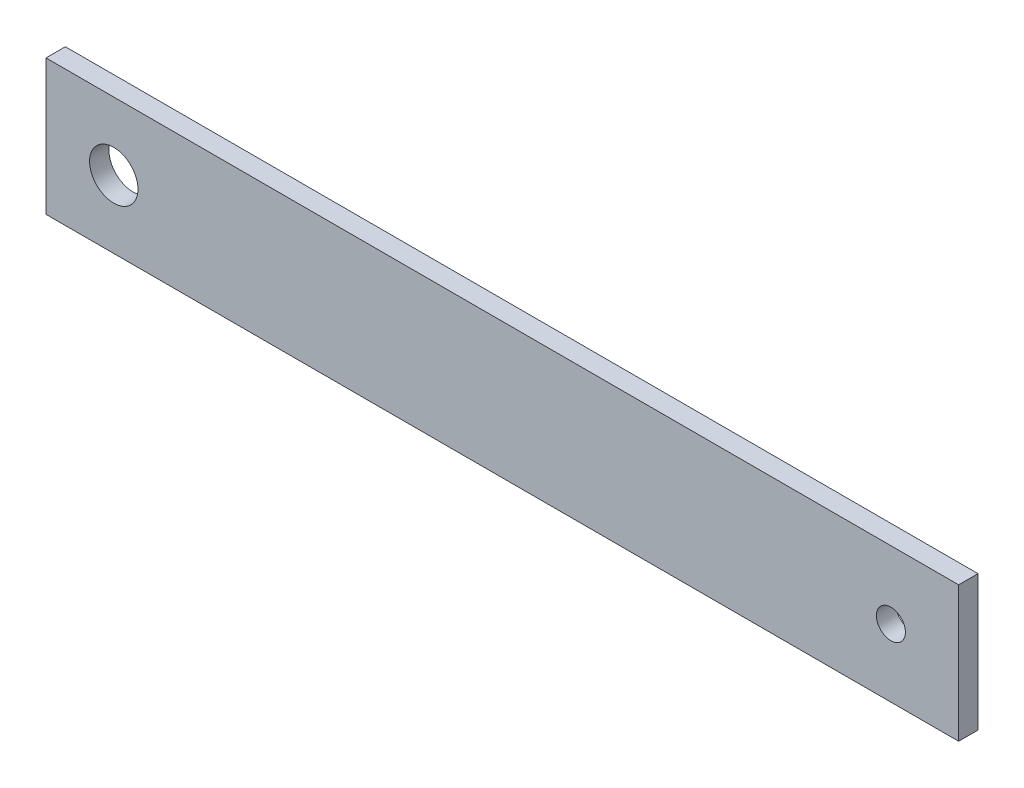
ISO-10303-21;
HEADER;
FILE_DESCRIPTION(('STEP AP214'),'2;1');
FILE_NAME('part.step','',(''),(''),'','','');
FILE_SCHEMA(('AUTOMOTIVE_DESIGN { 1 0 10303 214 1 1 1 1 }'));
ENDSEC;
DATA;
#1=APPLICATION_CONTEXT('core data for automotive mechanical design processes');
#2=APPLICATION_PROTOCOL_DEFINITION('international standard','automotive_design',2000,#1);
#3=PRODUCT_CONTEXT('',#1,'mechanical');
#4=PRODUCT('Part','Part','',(#3));
#5=PRODUCT_RELATED_PRODUCT_CATEGORY('part','',(#4));
#6=PRODUCT_DEFINITION_FORMATION('','',#4);
#7=PRODUCT_DEFINITION_CONTEXT('part definition',#1,'design');
#8=PRODUCT_DEFINITION('design','',#6,#7);
#9=PRODUCT_DEFINITION_SHAPE('','',#8);
#10=(LENGTH_UNIT() NAMED_UNIT(*) SI_UNIT(.MILLI.,.METRE.));
#11=(NAMED_UNIT(*) PLANE_ANGLE_UNIT() SI_UNIT($,.RADIAN.));
#12=(NAMED_UNIT(*) SI_UNIT($,.STERADIAN.) SOLID_ANGLE_UNIT());
#13=UNCERTAINTY_MEASURE_WITH_UNIT(LENGTH_MEASURE(1.E-05),#10,'distance_accuracy_value','');
#14=(GEOMETRIC_REPRESENTATION_CONTEXT(3) GLOBAL_UNCERTAINTY_ASSIGNED_CONTEXT((#13)) GLOBAL_UNIT_ASSIGNED_CONTEXT((#10,
#11,#12)) REPRESENTATION_CONTEXT('',''));
#15=CARTESIAN_POINT('',(0.,0.,0.));
#16=DIRECTION('',(0.,0.,1.));
#17=DIRECTION('',(1.,0.,0.));
#18=AXIS2_PLACEMENT_3D('',#15,#16,#17);
#19=CARTESIAN_POINT('',(0.,0.,2.));
#20=DIRECTION('',(0.,0.,-1.));
#21=DIRECTION('',(-1.,0.,0.));
#22=AXIS2_PLACEMENT_3D('',#19,#20,#21);
#23=PLANE('',#22);
#24=DIRECTION('',(0.,1.,0.));
#25=VECTOR('',#24,1.);
#26=CARTESIAN_POINT('',(174.6,-14.,2.));
#27=LINE('',#26,#25);
#28=CARTESIAN_POINT('',(174.6,-14.,2.));
#29=VERTEX_POINT('',#28);
#30=CARTESIAN_POINT('',(174.6,14.,2.));
#31=VERTEX_POINT('',#30);
#32=EDGE_CURVE('E99',#29,#31,#27,.T.);
#33=ORIENTED_EDGE('',*,*,#32,.T.);
#34=DIRECTION('',(-1.,0.,0.));
#35=VECTOR('',#34,1.);
#36=CARTESIAN_POINT('',(-14.,14.,2.));
#37=LINE('',#36,#35);
#38=CARTESIAN_POINT('',(-14.,14.,2.));
#39=VERTEX_POINT('',#38);
#40=EDGE_CURVE('E92',#31,#39,#37,.T.);
#41=ORIENTED_EDGE('',*,*,#40,.T.);
#42=DIRECTION('',(0.,-1.,0.));
#43=VECTOR('',#42,1.);
#44=CARTESIAN_POINT('',(-14.,-14.,2.));
#45=LINE('',#44,#43);
#46=CARTESIAN_POINT('',(-14.,-14.,2.));
#47=VERTEX_POINT('',#46);
#48=EDGE_CURVE('E98',#39,#47,#45,.T.);
#49=ORIENTED_EDGE('',*,*,#48,.T.);
#50=DIRECTION('',(1.,0.,0.));
#51=VECTOR('',#50,1.);
#52=CARTESIAN_POINT('',(-14.,-14.,2.));
#53=LINE('',#52,#51);
#54=EDGE_CURVE('E63',#47,#29,#53,.T.);
#55=ORIENTED_EDGE('',*,*,#54,.T.);
#56=EDGE_LOOP('',(#33,#41,#49,#55));
#57=FACE_BOUND('',#56,.T.);
#58=CARTESIAN_POINT('',(0.,0.,2.));
#59=DIRECTION('',(0.,0.,1.));
#60=DIRECTION('',(1.,0.,0.));
#61=AXIS2_PLACEMENT_3D('',#58,#59,#60);
#62=CIRCLE('',#61,5.);
#63=CARTESIAN_POINT('',(5.,0.,2.));
#64=VERTEX_POINT('',#63);
#65=EDGE_CURVE('E113',#64,#64,#62,.T.);
#66=ORIENTED_EDGE('',*,*,#65,.F.);
#67=EDGE_LOOP('',(#66));
#68=FACE_BOUND('',#67,.T.);
#69=CARTESIAN_POINT('',(160.6,0.,2.));
#70=DIRECTION('',(0.,0.,1.));
#71=DIRECTION('',(1.,0.,0.));
#72=AXIS2_PLACEMENT_3D('',#69,#70,#71);
#73=CIRCLE('',#72,3.);
#74=CARTESIAN_POINT('',(163.6,0.,2.));
#75=VERTEX_POINT('',#74);
#76=EDGE_CURVE('E128',#75,#75,#73,.T.);
#77=ORIENTED_EDGE('',*,*,#76,.F.);
#78=EDGE_LOOP('',(#77));
#79=FACE_BOUND('',#78,.T.);
#80=ADVANCED_FACE('F50',(#57,#68,#79),#23,.F.);
#81=CARTESIAN_POINT('',(0.,0.,-2.));
#82=DIRECTION('',(0.,0.,-1.));
#83=DIRECTION('',(-1.,0.,0.));
#84=AXIS2_PLACEMENT_3D('',#81,#82,#83);
#85=PLANE('',#84);
#86=CARTESIAN_POINT('',(0.,0.,-2.));
#87=DIRECTION('',(0.,0.,1.));
#88=DIRECTION('',(1.,0.,0.));
#89=AXIS2_PLACEMENT_3D('',#86,#87,#88);
#90=CIRCLE('',#89,5.);
#91=CARTESIAN_POINT('',(5.,0.,-2.));
#92=VERTEX_POINT('',#91);
#93=EDGE_CURVE('E130',#92,#92,#90,.T.);
#94=ORIENTED_EDGE('',*,*,#93,.T.);
#95=EDGE_LOOP('',(#94));
#96=FACE_BOUND('',#95,.T.);
#97=DIRECTION('',(0.,1.,0.));
#98=VECTOR('',#97,1.);
#99=CARTESIAN_POINT('',(174.6,-14.,-2.));
#100=LINE('',#99,#98);
#101=CARTESIAN_POINT('',(174.6,-14.,-2.));
#102=VERTEX_POINT('',#101);
#103=CARTESIAN_POINT('',(174.6,14.,-2.));
#104=VERTEX_POINT('',#103);
#105=EDGE_CURVE('E115',#102,#104,#100,.T.);
#106=ORIENTED_EDGE('',*,*,#105,.F.);
#107=DIRECTION('',(1.,0.,0.));
#108=VECTOR('',#107,1.);
#109=CARTESIAN_POINT('',(-14.,-14.,-2.));
#110=LINE('',#109,#108);
#111=CARTESIAN_POINT('',(-14.,-14.,-2.));
#112=VERTEX_POINT('',#111);
#113=EDGE_CURVE('E86',#112,#102,#110,.T.);
#114=ORIENTED_EDGE('',*,*,#113,.F.);
#115=DIRECTION('',(0.,-1.,0.));
#116=VECTOR('',#115,1.);
#117=CARTESIAN_POINT('',(-14.,-14.,-2.));
#118=LINE('',#117,#116);
#119=CARTESIAN_POINT('',(-14.,14.,-2.));
#120=VERTEX_POINT('',#119);
#121=EDGE_CURVE('E82',#120,#112,#118,.T.);
#122=ORIENTED_EDGE('',*,*,#121,.F.);
#123=DIRECTION('',(-1.,0.,0.));
#124=VECTOR('',#123,1.);
#125=CARTESIAN_POINT('',(-14.,14.,-2.));
#126=LINE('',#125,#124);
#127=EDGE_CURVE('E102',#104,#120,#126,.T.);
#128=ORIENTED_EDGE('',*,*,#127,.F.);
#129=EDGE_LOOP('',(#106,#114,#122,#128));
#130=FACE_BOUND('',#129,.T.);
#131=CARTESIAN_POINT('',(160.6,0.,-2.));
#132=DIRECTION('',(0.,0.,1.));
#133=DIRECTION('',(1.,0.,0.));
#134=AXIS2_PLACEMENT_3D('',#131,#132,#133);
#135=CIRCLE('',#134,3.);
#136=CARTESIAN_POINT('',(163.6,0.,-2.));
#137=VERTEX_POINT('',#136);
#138=EDGE_CURVE('E135',#137,#137,#135,.T.);
#139=ORIENTED_EDGE('',*,*,#138,.T.);
#140=EDGE_LOOP('',(#139));
#141=FACE_BOUND('',#140,.T.);
#142=ADVANCED_FACE('F124',(#96,#130,#141),#85,.T.);
#143=CARTESIAN_POINT('',(174.6,-14.,2.));
#144=DIRECTION('',(-1.,0.,0.));
#145=DIRECTION('',(0.,0.,1.));
#146=AXIS2_PLACEMENT_3D('',#143,#144,#145);
#147=PLANE('',#146);
#148=ORIENTED_EDGE('',*,*,#105,.T.);
#149=DIRECTION('',(0.,0.,-1.));
#150=VECTOR('',#149,1.);
#151=CARTESIAN_POINT('',(174.6,14.,2.));
#152=LINE('',#151,#150);
#153=EDGE_CURVE('E11',#31,#104,#152,.T.);
#154=ORIENTED_EDGE('',*,*,#153,.F.);
#155=ORIENTED_EDGE('',*,*,#32,.F.);
#156=DIRECTION('',(0.,0.,-1.));
#157=VECTOR('',#156,1.);
#158=CARTESIAN_POINT('',(174.6,-14.,2.));
#159=LINE('',#158,#157);
#160=EDGE_CURVE('E107',#29,#102,#159,.T.);
#161=ORIENTED_EDGE('',*,*,#160,.T.);
#162=EDGE_LOOP('',(#148,#154,#155,#161));
#163=FACE_BOUND('',#162,.T.);
#164=ADVANCED_FACE('F49',(#163),#147,.F.);
#165=CARTESIAN_POINT('',(-14.,14.,2.));
#166=DIRECTION('',(0.,-1.,0.));
#167=DIRECTION('',(0.,0.,-1.));
#168=AXIS2_PLACEMENT_3D('',#165,#166,#167);
#169=PLANE('',#168);
#170=ORIENTED_EDGE('',*,*,#127,.T.);
#171=DIRECTION('',(0.,0.,-1.));
#172=VECTOR('',#171,1.);
#173=CARTESIAN_POINT('',(-14.,14.,2.));
#174=LINE('',#173,#172);
#175=EDGE_CURVE('E60',#39,#120,#174,.T.);
#176=ORIENTED_EDGE('',*,*,#175,.F.);
#177=ORIENTED_EDGE('',*,*,#40,.F.);
#178=ORIENTED_EDGE('',*,*,#153,.T.);
#179=EDGE_LOOP('',(#170,#176,#177,#178));
#180=FACE_BOUND('',#179,.T.);
#181=ADVANCED_FACE('F103',(#180),#169,.F.);
#182=CARTESIAN_POINT('',(-14.,-14.,2.));
#183=DIRECTION('',(1.,0.,0.));
#184=DIRECTION('',(0.,0.,-1.));
#185=AXIS2_PLACEMENT_3D('',#182,#183,#184);
#186=PLANE('',#185);
#187=ORIENTED_EDGE('',*,*,#121,.T.);
#188=DIRECTION('',(0.,0.,-1.));
#189=VECTOR('',#188,1.);
#190=CARTESIAN_POINT('',(-14.,-14.,2.));
#191=LINE('',#190,#189);
#192=EDGE_CURVE('E104',#47,#112,#191,.T.);
#193=ORIENTED_EDGE('',*,*,#192,.F.);
#194=ORIENTED_EDGE('',*,*,#48,.F.);
#195=ORIENTED_EDGE('',*,*,#175,.T.);
#196=EDGE_LOOP('',(#187,#193,#194,#195));
#197=FACE_BOUND('',#196,.T.);
#198=ADVANCED_FACE('F106',(#197),#186,.F.);
#199=CARTESIAN_POINT('',(-14.,-14.,2.));
#200=DIRECTION('',(0.,1.,0.));
#201=DIRECTION('',(0.,0.,1.));
#202=AXIS2_PLACEMENT_3D('',#199,#200,#201);
#203=PLANE('',#202);
#204=ORIENTED_EDGE('',*,*,#113,.T.);
#205=ORIENTED_EDGE('',*,*,#160,.F.);
#206=ORIENTED_EDGE('',*,*,#54,.F.);
#207=ORIENTED_EDGE('',*,*,#192,.T.);
#208=EDGE_LOOP('',(#204,#205,#206,#207));
#209=FACE_BOUND('',#208,.T.);
#210=ADVANCED_FACE('F118',(#209),#203,.F.);
#211=CARTESIAN_POINT('',(0.,0.,2.));
#212=DIRECTION('',(0.,0.,-1.));
#213=DIRECTION('',(-1.,0.,0.));
#214=AXIS2_PLACEMENT_3D('',#211,#212,#213);
#215=CYLINDRICAL_SURFACE('',#214,5.);
#216=ORIENTED_EDGE('',*,*,#65,.T.);
#217=EDGE_LOOP('',(#216));
#218=FACE_BOUND('',#217,.T.);
#219=ORIENTED_EDGE('',*,*,#93,.F.);
#220=EDGE_LOOP('',(#219));
#221=FACE_BOUND('',#220,.T.);
#222=ADVANCED_FACE('F153',(#218,#221),#215,.F.);
#223=CARTESIAN_POINT('',(160.6,0.,2.));
#224=DIRECTION('',(0.,0.,-1.));
#225=DIRECTION('',(-1.,0.,0.));
#226=AXIS2_PLACEMENT_3D('',#223,#224,#225);
#227=CYLINDRICAL_SURFACE('',#226,3.);
#228=ORIENTED_EDGE('',*,*,#76,.T.);
#229=EDGE_LOOP('',(#228));
#230=FACE_BOUND('',#229,.T.);
#231=ORIENTED_EDGE('',*,*,#138,.F.);
#232=EDGE_LOOP('',(#231));
#233=FACE_BOUND('',#232,.T.);
#234=ADVANCED_FACE('F138',(#230,#233),#227,.F.);
#235=CLOSED_SHELL('',(#80,#142,#164,#181,#198,#210,#222,#234));
#236=MANIFOLD_SOLID_BREP('B2',#235);
#237=ADVANCED_BREP_SHAPE_REPRESENTATION('',(#18,#236),#14);
#238=SHAPE_DEFINITION_REPRESENTATION(#9,#237);
ENDSEC;
END-ISO-10303-21;
